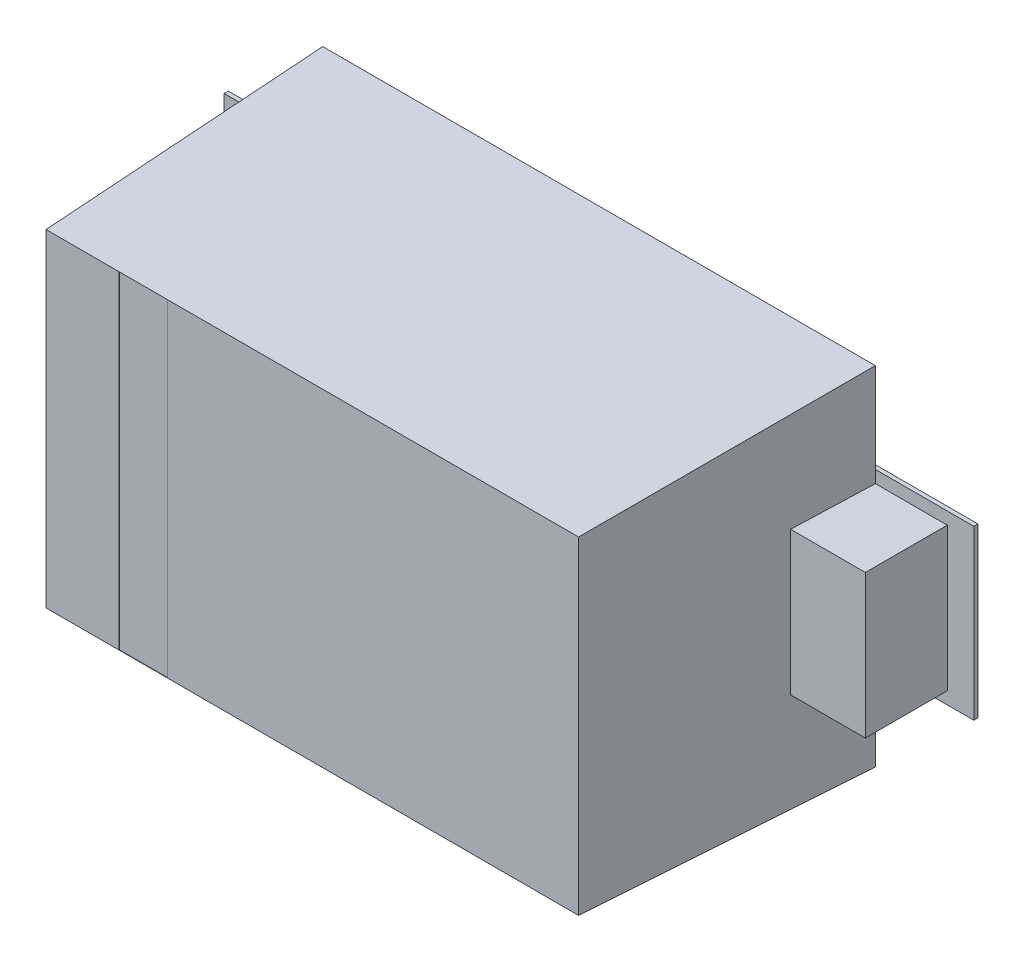
ISO-10303-21;
HEADER;
FILE_DESCRIPTION(('STEP AP214'),'2;1');
FILE_NAME('part.step','',(''),(''),'','','');
FILE_SCHEMA(('AUTOMOTIVE_DESIGN { 1 0 10303 214 1 1 1 1 }'));
ENDSEC;
DATA;
#1=APPLICATION_CONTEXT('core data for automotive mechanical design processes');
#2=APPLICATION_PROTOCOL_DEFINITION('international standard','automotive_design',2000,#1);
#3=PRODUCT_CONTEXT('',#1,'mechanical');
#4=PRODUCT('Part','Part','',(#3));
#5=PRODUCT_RELATED_PRODUCT_CATEGORY('part','',(#4));
#6=PRODUCT_DEFINITION_FORMATION('','',#4);
#7=PRODUCT_DEFINITION_CONTEXT('part definition',#1,'design');
#8=PRODUCT_DEFINITION('design','',#6,#7);
#9=PRODUCT_DEFINITION_SHAPE('','',#8);
#10=(LENGTH_UNIT() NAMED_UNIT(*) SI_UNIT(.MILLI.,.METRE.));
#11=(NAMED_UNIT(*) PLANE_ANGLE_UNIT() SI_UNIT($,.RADIAN.));
#12=(NAMED_UNIT(*) SI_UNIT($,.STERADIAN.) SOLID_ANGLE_UNIT());
#13=UNCERTAINTY_MEASURE_WITH_UNIT(LENGTH_MEASURE(1.E-05),#10,'distance_accuracy_value','');
#14=(GEOMETRIC_REPRESENTATION_CONTEXT(3) GLOBAL_UNCERTAINTY_ASSIGNED_CONTEXT((#13)) GLOBAL_UNIT_ASSIGNED_CONTEXT((#10,
#11,#12)) REPRESENTATION_CONTEXT('',''));
#15=CARTESIAN_POINT('',(0.,0.,0.));
#16=DIRECTION('',(0.,0.,1.));
#17=DIRECTION('',(1.,0.,0.));
#18=AXIS2_PLACEMENT_3D('',#15,#16,#17);
#19=CARTESIAN_POINT('',(-0.85,-1.55082251453114,0.21));
#20=DIRECTION('',(1.,0.,0.));
#21=DIRECTION('',(0.,0.,-1.));
#22=AXIS2_PLACEMENT_3D('',#19,#20,#21);
#23=PLANE('',#22);
#24=DIRECTION('',(0.,1.,0.));
#25=VECTOR('',#24,1.);
#26=CARTESIAN_POINT('',(-0.85,-1.55082251453114,0.21));
#27=LINE('',#26,#25);
#28=CARTESIAN_POINT('',(-0.85,0.175,0.21));
#29=VERTEX_POINT('',#28);
#30=CARTESIAN_POINT('',(-0.85,-0.175,0.21));
#31=VERTEX_POINT('',#30);
#32=EDGE_CURVE('E261',#29,#31,#27,.F.);
#33=ORIENTED_EDGE('',*,*,#32,.F.);
#34=DIRECTION('',(0.,0.,1.));
#35=VECTOR('',#34,1.);
#36=CARTESIAN_POINT('',(-0.85,0.175,0.21));
#37=LINE('',#36,#35);
#38=CARTESIAN_POINT('',(-0.85,0.175,0.01));
#39=VERTEX_POINT('',#38);
#40=EDGE_CURVE('E253',#39,#29,#37,.T.);
#41=ORIENTED_EDGE('',*,*,#40,.F.);
#42=DIRECTION('',(0.,1.,0.));
#43=VECTOR('',#42,1.);
#44=CARTESIAN_POINT('',(-0.85,-0.205,0.01));
#45=LINE('',#44,#43);
#46=CARTESIAN_POINT('',(-0.85,-0.175,0.01));
#47=VERTEX_POINT('',#46);
#48=EDGE_CURVE('E274',#47,#39,#45,.T.);
#49=ORIENTED_EDGE('',*,*,#48,.F.);
#50=DIRECTION('',(0.,0.,1.));
#51=VECTOR('',#50,1.);
#52=CARTESIAN_POINT('',(-0.85,-0.175,0.21));
#53=LINE('',#52,#51);
#54=EDGE_CURVE('E263',#47,#31,#53,.T.);
#55=ORIENTED_EDGE('',*,*,#54,.T.);
#56=EDGE_LOOP('',(#33,#41,#49,#55));
#57=FACE_BOUND('',#56,.T.);
#58=ADVANCED_FACE('F16',(#57),#23,.F.);
#59=CARTESIAN_POINT('',(-0.471442359222918,0.4,0.709));
#60=DIRECTION('',(-1.,0.,0.));
#61=DIRECTION('',(0.,0.,1.));
#62=AXIS2_PLACEMENT_3D('',#59,#60,#61);
#63=PLANE('',#62);
#64=DIRECTION('',(0.,1.,0.));
#65=VECTOR('',#64,1.);
#66=CARTESIAN_POINT('',(-0.471442359222918,-0.4,0.709));
#67=LINE('',#66,#65);
#68=CARTESIAN_POINT('',(-0.471442359222918,0.4,0.709));
#69=VERTEX_POINT('',#68);
#70=CARTESIAN_POINT('',(-0.471442359222918,-0.4,0.709));
#71=VERTEX_POINT('',#70);
#72=EDGE_CURVE('E240',#69,#71,#67,.F.);
#73=ORIENTED_EDGE('',*,*,#72,.F.);
#74=DIRECTION('',(0.,0.,1.));
#75=VECTOR('',#74,1.);
#76=CARTESIAN_POINT('',(-0.471442359222918,0.4,0.709));
#77=LINE('',#76,#75);
#78=CARTESIAN_POINT('',(-0.471442359222918,0.4,0.71));
#79=VERTEX_POINT('',#78);
#80=EDGE_CURVE('E248',#69,#79,#77,.T.);
#81=ORIENTED_EDGE('',*,*,#80,.T.);
#82=DIRECTION('',(0.,1.,0.));
#83=VECTOR('',#82,1.);
#84=CARTESIAN_POINT('',(-0.471442359222918,-0.4,0.71));
#85=LINE('',#84,#83);
#86=CARTESIAN_POINT('',(-0.471442359222918,-0.4,0.71));
#87=VERTEX_POINT('',#86);
#88=EDGE_CURVE('E247',#87,#79,#85,.T.);
#89=ORIENTED_EDGE('',*,*,#88,.F.);
#90=DIRECTION('',(0.,0.,1.));
#91=VECTOR('',#90,1.);
#92=CARTESIAN_POINT('',(-0.471442359222918,-0.4,0.709));
#93=LINE('',#92,#91);
#94=EDGE_CURVE('E245',#87,#71,#93,.F.);
#95=ORIENTED_EDGE('',*,*,#94,.T.);
#96=EDGE_LOOP('',(#73,#81,#89,#95));
#97=FACE_BOUND('',#96,.T.);
#98=ADVANCED_FACE('F813',(#97),#63,.F.);
#99=CARTESIAN_POINT('',(-0.471442359222918,-0.4,0.709));
#100=DIRECTION('',(0.,0.,1.));
#101=DIRECTION('',(1.,0.,0.));
#102=AXIS2_PLACEMENT_3D('',#99,#100,#101);
#103=PLANE('',#102);
#104=ORIENTED_EDGE('',*,*,#72,.T.);
#105=DIRECTION('',(1.,0.,0.));
#106=VECTOR('',#105,1.);
#107=CARTESIAN_POINT('',(-0.471442359222918,-0.4,0.709));
#108=LINE('',#107,#106);
#109=CARTESIAN_POINT('',(-0.353826801828427,-0.4,0.709));
#110=VERTEX_POINT('',#109);
#111=EDGE_CURVE('E244',#71,#110,#108,.T.);
#112=ORIENTED_EDGE('',*,*,#111,.T.);
#113=DIRECTION('',(0.,1.,0.));
#114=VECTOR('',#113,1.);
#115=CARTESIAN_POINT('',(-0.353826801828427,0.4,0.709));
#116=LINE('',#115,#114);
#117=CARTESIAN_POINT('',(-0.353826801828427,0.4,0.709));
#118=VERTEX_POINT('',#117);
#119=EDGE_CURVE('E195',#110,#118,#116,.T.);
#120=ORIENTED_EDGE('',*,*,#119,.T.);
#121=DIRECTION('',(1.,0.,0.));
#122=VECTOR('',#121,1.);
#123=CARTESIAN_POINT('',(-0.471442359222918,0.4,0.709));
#124=LINE('',#123,#122);
#125=EDGE_CURVE('E193',#118,#69,#124,.F.);
#126=ORIENTED_EDGE('',*,*,#125,.T.);
#127=EDGE_LOOP('',(#104,#112,#120,#126));
#128=FACE_BOUND('',#127,.T.);
#129=ADVANCED_FACE('F804',(#128),#103,.T.);
#130=CARTESIAN_POINT('',(-0.353826801828427,0.4,0.709));
#131=DIRECTION('',(1.,0.,0.));
#132=DIRECTION('',(0.,0.,-1.));
#133=AXIS2_PLACEMENT_3D('',#130,#131,#132);
#134=PLANE('',#133);
#135=ORIENTED_EDGE('',*,*,#119,.F.);
#136=DIRECTION('',(0.,0.,-1.));
#137=VECTOR('',#136,1.);
#138=CARTESIAN_POINT('',(-0.353826801828427,-0.4,0.709));
#139=LINE('',#138,#137);
#140=CARTESIAN_POINT('',(-0.353826801828427,-0.4,0.71));
#141=VERTEX_POINT('',#140);
#142=EDGE_CURVE('E200',#110,#141,#139,.F.);
#143=ORIENTED_EDGE('',*,*,#142,.T.);
#144=DIRECTION('',(0.,1.,0.));
#145=VECTOR('',#144,1.);
#146=CARTESIAN_POINT('',(-0.353826801828427,-0.4,0.71));
#147=LINE('',#146,#145);
#148=CARTESIAN_POINT('',(-0.353826801828427,0.4,0.71));
#149=VERTEX_POINT('',#148);
#150=EDGE_CURVE('E197',#149,#141,#147,.F.);
#151=ORIENTED_EDGE('',*,*,#150,.F.);
#152=DIRECTION('',(0.,0.,-1.));
#153=VECTOR('',#152,1.);
#154=CARTESIAN_POINT('',(-0.353826801828427,0.4,0.709));
#155=LINE('',#154,#153);
#156=EDGE_CURVE('E19',#149,#118,#155,.T.);
#157=ORIENTED_EDGE('',*,*,#156,.T.);
#158=EDGE_LOOP('',(#135,#143,#151,#157));
#159=FACE_BOUND('',#158,.T.);
#160=ADVANCED_FACE('F198',(#159),#134,.F.);
#161=CARTESIAN_POINT('',(0.85,-1.55082251453114,0.21));
#162=DIRECTION('',(1.,0.,0.));
#163=DIRECTION('',(0.,0.,-1.));
#164=AXIS2_PLACEMENT_3D('',#161,#162,#163);
#165=PLANE('',#164);
#166=DIRECTION('',(0.,1.,0.));
#167=VECTOR('',#166,1.);
#168=CARTESIAN_POINT('',(0.85,-0.205,0.01));
#169=LINE('',#168,#167);
#170=CARTESIAN_POINT('',(0.85,-0.175,0.01));
#171=VERTEX_POINT('',#170);
#172=CARTESIAN_POINT('',(0.85,0.175,0.01));
#173=VERTEX_POINT('',#172);
#174=EDGE_CURVE('E329',#171,#173,#169,.T.);
#175=ORIENTED_EDGE('',*,*,#174,.T.);
#176=DIRECTION('',(0.,0.,-1.));
#177=VECTOR('',#176,1.);
#178=CARTESIAN_POINT('',(0.85,0.175,0.21));
#179=LINE('',#178,#177);
#180=CARTESIAN_POINT('',(0.85,0.175,0.21));
#181=VERTEX_POINT('',#180);
#182=EDGE_CURVE('E322',#173,#181,#179,.F.);
#183=ORIENTED_EDGE('',*,*,#182,.T.);
#184=DIRECTION('',(0.,1.,0.));
#185=VECTOR('',#184,1.);
#186=CARTESIAN_POINT('',(0.85,-1.55082251453114,0.21));
#187=LINE('',#186,#185);
#188=CARTESIAN_POINT('',(0.85,-0.175,0.21));
#189=VERTEX_POINT('',#188);
#190=EDGE_CURVE('E317',#189,#181,#187,.T.);
#191=ORIENTED_EDGE('',*,*,#190,.F.);
#192=DIRECTION('',(0.,0.,-1.));
#193=VECTOR('',#192,1.);
#194=CARTESIAN_POINT('',(0.85,-0.175,0.21));
#195=LINE('',#194,#193);
#196=EDGE_CURVE('E243',#171,#189,#195,.F.);
#197=ORIENTED_EDGE('',*,*,#196,.F.);
#198=EDGE_LOOP('',(#175,#183,#191,#197));
#199=FACE_BOUND('',#198,.T.);
#200=ADVANCED_FACE('F498',(#199),#165,.T.);
#201=CARTESIAN_POINT('',(-0.471442359222918,0.4,0.709));
#202=DIRECTION('',(0.,1.,0.));
#203=DIRECTION('',(0.,0.,1.));
#204=AXIS2_PLACEMENT_3D('',#201,#202,#203);
#205=PLANE('',#204);
#206=ORIENTED_EDGE('',*,*,#125,.F.);
#207=ORIENTED_EDGE('',*,*,#156,.F.);
#208=DIRECTION('',(1.,0.,0.));
#209=VECTOR('',#208,1.);
#210=CARTESIAN_POINT('',(-0.65,0.4,0.71));
#211=LINE('',#210,#209);
#212=EDGE_CURVE('E191',#79,#149,#211,.T.);
#213=ORIENTED_EDGE('',*,*,#212,.F.);
#214=ORIENTED_EDGE('',*,*,#80,.F.);
#215=EDGE_LOOP('',(#206,#207,#213,#214));
#216=FACE_BOUND('',#215,.T.);
#217=ADVANCED_FACE('F188',(#216),#205,.F.);
#218=CARTESIAN_POINT('',(-0.914999999999999,-0.205,0.));
#219=DIRECTION('',(0.,0.,1.));
#220=DIRECTION('',(1.,0.,0.));
#221=AXIS2_PLACEMENT_3D('',#218,#219,#220);
#222=PLANE('',#221);
#223=DIRECTION('',(0.,1.,0.));
#224=VECTOR('',#223,1.);
#225=CARTESIAN_POINT('',(-0.504999999999999,0.205,0.));
#226=LINE('',#225,#224);
#227=CARTESIAN_POINT('',(-0.504999999999999,0.205,0.));
#228=VERTEX_POINT('',#227);
#229=CARTESIAN_POINT('',(-0.504999999999999,-0.205,0.));
#230=VERTEX_POINT('',#229);
#231=EDGE_CURVE('E361',#228,#230,#226,.F.);
#232=ORIENTED_EDGE('',*,*,#231,.T.);
#233=DIRECTION('',(1.,0.,0.));
#234=VECTOR('',#233,1.);
#235=CARTESIAN_POINT('',(-0.914999999999999,-0.205,0.));
#236=LINE('',#235,#234);
#237=CARTESIAN_POINT('',(-0.914999999999999,-0.205,0.));
#238=VERTEX_POINT('',#237);
#239=EDGE_CURVE('E364',#230,#238,#236,.F.);
#240=ORIENTED_EDGE('',*,*,#239,.T.);
#241=DIRECTION('',(0.,1.,0.));
#242=VECTOR('',#241,1.);
#243=CARTESIAN_POINT('',(-0.914999999999999,0.205,0.));
#244=LINE('',#243,#242);
#245=CARTESIAN_POINT('',(-0.914999999999999,0.205,0.));
#246=VERTEX_POINT('',#245);
#247=EDGE_CURVE('E249',#238,#246,#244,.T.);
#248=ORIENTED_EDGE('',*,*,#247,.T.);
#249=DIRECTION('',(1.,0.,0.));
#250=VECTOR('',#249,1.);
#251=CARTESIAN_POINT('',(-0.914999999999999,0.205,0.));
#252=LINE('',#251,#250);
#253=EDGE_CURVE('E218',#246,#228,#252,.T.);
#254=ORIENTED_EDGE('',*,*,#253,.T.);
#255=EDGE_LOOP('',(#232,#240,#248,#254));
#256=FACE_BOUND('',#255,.T.);
#257=ADVANCED_FACE('F489',(#256),#222,.F.);
#258=CARTESIAN_POINT('',(-0.914999999999999,0.205,0.01));
#259=DIRECTION('',(1.,0.,0.));
#260=DIRECTION('',(0.,0.,-1.));
#261=AXIS2_PLACEMENT_3D('',#258,#259,#260);
#262=PLANE('',#261);
#263=DIRECTION('',(0.,1.,0.));
#264=VECTOR('',#263,1.);
#265=CARTESIAN_POINT('',(-0.914999999999999,-0.205,0.01));
#266=LINE('',#265,#264);
#267=CARTESIAN_POINT('',(-0.914999999999999,0.205,0.01));
#268=VERTEX_POINT('',#267);
#269=CARTESIAN_POINT('',(-0.914999999999999,-0.205,0.01));
#270=VERTEX_POINT('',#269);
#271=EDGE_CURVE('E269',#268,#270,#266,.F.);
#272=ORIENTED_EDGE('',*,*,#271,.F.);
#273=DIRECTION('',(0.,0.,-1.));
#274=VECTOR('',#273,1.);
#275=CARTESIAN_POINT('',(-0.914999999999999,0.205,0.01));
#276=LINE('',#275,#274);
#277=EDGE_CURVE('E355',#268,#246,#276,.T.);
#278=ORIENTED_EDGE('',*,*,#277,.T.);
#279=ORIENTED_EDGE('',*,*,#247,.F.);
#280=DIRECTION('',(0.,0.,1.));
#281=VECTOR('',#280,1.);
#282=CARTESIAN_POINT('',(-0.914999999999999,-0.205,0.01));
#283=LINE('',#282,#281);
#284=EDGE_CURVE('E367',#238,#270,#283,.T.);
#285=ORIENTED_EDGE('',*,*,#284,.T.);
#286=EDGE_LOOP('',(#272,#278,#279,#285));
#287=FACE_BOUND('',#286,.T.);
#288=ADVANCED_FACE('F487',(#287),#262,.F.);
#289=CARTESIAN_POINT('',(-0.0324999999999995,0.175,0.21));
#290=DIRECTION('',(0.,1.,0.));
#291=DIRECTION('',(0.,0.,1.));
#292=AXIS2_PLACEMENT_3D('',#289,#290,#291);
#293=PLANE('',#292);
#294=DIRECTION('',(1.,0.,0.));
#295=VECTOR('',#294,1.);
#296=CARTESIAN_POINT('',(-0.0324999999999995,0.175,0.21));
#297=LINE('',#296,#295);
#298=CARTESIAN_POINT('',(-0.667460384745874,0.175,0.21));
#299=VERTEX_POINT('',#298);
#300=EDGE_CURVE('E258',#299,#29,#297,.F.);
#301=ORIENTED_EDGE('',*,*,#300,.F.);
#302=DIRECTION('',(0.034899496702501,0.,0.999390827019096));
#303=VECTOR('',#302,1.);
#304=CARTESIAN_POINT('',(-0.65,0.175,0.71));
#305=LINE('',#304,#303);
#306=CARTESIAN_POINT('',(-0.674444538644223,0.175,0.01));
#307=VERTEX_POINT('',#306);
#308=EDGE_CURVE('E379',#307,#299,#305,.T.);
#309=ORIENTED_EDGE('',*,*,#308,.F.);
#310=DIRECTION('',(1.,0.,0.));
#311=VECTOR('',#310,1.);
#312=CARTESIAN_POINT('',(-0.914999999999999,0.175,0.01));
#313=LINE('',#312,#311);
#314=EDGE_CURVE('E276',#39,#307,#313,.T.);
#315=ORIENTED_EDGE('',*,*,#314,.F.);
#316=ORIENTED_EDGE('',*,*,#40,.T.);
#317=EDGE_LOOP('',(#301,#309,#315,#316));
#318=FACE_BOUND('',#317,.T.);
#319=ADVANCED_FACE('F474',(#318),#293,.T.);
#320=CARTESIAN_POINT('',(-0.0324999999999995,-1.55082251453114,0.21));
#321=DIRECTION('',(0.,0.,1.));
#322=DIRECTION('',(1.,0.,0.));
#323=AXIS2_PLACEMENT_3D('',#320,#321,#322);
#324=PLANE('',#323);
#325=DIRECTION('',(1.,0.,0.));
#326=VECTOR('',#325,1.);
#327=CARTESIAN_POINT('',(-0.0324999999999995,-0.175,0.21));
#328=LINE('',#327,#326);
#329=CARTESIAN_POINT('',(-0.667460384745874,-0.175,0.21));
#330=VERTEX_POINT('',#329);
#331=EDGE_CURVE('E266',#31,#330,#328,.T.);
#332=ORIENTED_EDGE('',*,*,#331,.T.);
#333=DIRECTION('',(0.,1.,0.));
#334=VECTOR('',#333,1.);
#335=CARTESIAN_POINT('',(-0.667460384745874,0.4,0.21));
#336=LINE('',#335,#334);
#337=EDGE_CURVE('E381',#299,#330,#336,.F.);
#338=ORIENTED_EDGE('',*,*,#337,.F.);
#339=ORIENTED_EDGE('',*,*,#300,.T.);
#340=ORIENTED_EDGE('',*,*,#32,.T.);
#341=EDGE_LOOP('',(#332,#338,#339,#340));
#342=FACE_BOUND('',#341,.T.);
#343=ADVANCED_FACE('F479',(#342),#324,.T.);
#344=CARTESIAN_POINT('',(-0.0324999999999995,-0.175,0.21));
#345=DIRECTION('',(0.,1.,0.));
#346=DIRECTION('',(0.,0.,1.));
#347=AXIS2_PLACEMENT_3D('',#344,#345,#346);
#348=PLANE('',#347);
#349=ORIENTED_EDGE('',*,*,#54,.F.);
#350=DIRECTION('',(1.,0.,0.));
#351=VECTOR('',#350,1.);
#352=CARTESIAN_POINT('',(-0.914999999999999,-0.175,0.01));
#353=LINE('',#352,#351);
#354=CARTESIAN_POINT('',(-0.674444538644223,-0.175,0.01));
#355=VERTEX_POINT('',#354);
#356=EDGE_CURVE('E271',#355,#47,#353,.F.);
#357=ORIENTED_EDGE('',*,*,#356,.F.);
#358=DIRECTION('',(0.034899496702501,0.,0.999390827019096));
#359=VECTOR('',#358,1.);
#360=CARTESIAN_POINT('',(-0.65,-0.175,0.71));
#361=LINE('',#360,#359);
#362=EDGE_CURVE('E383',#330,#355,#361,.F.);
#363=ORIENTED_EDGE('',*,*,#362,.F.);
#364=ORIENTED_EDGE('',*,*,#331,.F.);
#365=EDGE_LOOP('',(#349,#357,#363,#364));
#366=FACE_BOUND('',#365,.T.);
#367=ADVANCED_FACE('F484',(#366),#348,.F.);
#368=CARTESIAN_POINT('',(-0.914999999999999,-0.205,0.01));
#369=DIRECTION('',(0.,0.,1.));
#370=DIRECTION('',(1.,0.,0.));
#371=AXIS2_PLACEMENT_3D('',#368,#369,#370);
#372=PLANE('',#371);
#373=ORIENTED_EDGE('',*,*,#314,.T.);
#374=DIRECTION('',(0.,1.,0.));
#375=VECTOR('',#374,1.);
#376=CARTESIAN_POINT('',(-0.674444538644223,0.4,0.01));
#377=LINE('',#376,#375);
#378=CARTESIAN_POINT('',(-0.674444538644223,0.205,0.01));
#379=VERTEX_POINT('',#378);
#380=EDGE_CURVE('E376',#379,#307,#377,.F.);
#381=ORIENTED_EDGE('',*,*,#380,.F.);
#382=DIRECTION('',(1.,0.,0.));
#383=VECTOR('',#382,1.);
#384=CARTESIAN_POINT('',(-0.914999999999999,0.205,0.01));
#385=LINE('',#384,#383);
#386=EDGE_CURVE('E352',#379,#268,#385,.F.);
#387=ORIENTED_EDGE('',*,*,#386,.T.);
#388=ORIENTED_EDGE('',*,*,#271,.T.);
#389=DIRECTION('',(1.,0.,0.));
#390=VECTOR('',#389,1.);
#391=CARTESIAN_POINT('',(-0.914999999999999,-0.205,0.01));
#392=LINE('',#391,#390);
#393=CARTESIAN_POINT('',(-0.674444538644223,-0.205,0.01));
#394=VERTEX_POINT('',#393);
#395=EDGE_CURVE('E370',#270,#394,#392,.T.);
#396=ORIENTED_EDGE('',*,*,#395,.T.);
#397=DIRECTION('',(0.,1.,0.));
#398=VECTOR('',#397,1.);
#399=CARTESIAN_POINT('',(-0.674444538644223,0.4,0.01));
#400=LINE('',#399,#398);
#401=EDGE_CURVE('E294',#355,#394,#400,.F.);
#402=ORIENTED_EDGE('',*,*,#401,.F.);
#403=ORIENTED_EDGE('',*,*,#356,.T.);
#404=ORIENTED_EDGE('',*,*,#48,.T.);
#405=EDGE_LOOP('',(#373,#381,#387,#388,#396,#402,#403,#404));
#406=FACE_BOUND('',#405,.T.);
#407=ADVANCED_FACE('F469',(#406),#372,.T.);
#408=CARTESIAN_POINT('',(-0.65,-0.4,0.71));
#409=DIRECTION('',(0.,0.,1.));
#410=DIRECTION('',(1.,0.,0.));
#411=AXIS2_PLACEMENT_3D('',#408,#409,#410);
#412=PLANE('',#411);
#413=ORIENTED_EDGE('',*,*,#88,.T.);
#414=DIRECTION('',(1.,0.,0.));
#415=VECTOR('',#414,1.);
#416=CARTESIAN_POINT('',(-0.65,0.4,0.71));
#417=LINE('',#416,#415);
#418=CARTESIAN_POINT('',(-0.65,0.4,0.71));
#419=VERTEX_POINT('',#418);
#420=EDGE_CURVE('E216',#419,#79,#417,.T.);
#421=ORIENTED_EDGE('',*,*,#420,.F.);
#422=DIRECTION('',(0.,1.,0.));
#423=VECTOR('',#422,1.);
#424=CARTESIAN_POINT('',(-0.65,0.4,0.71));
#425=LINE('',#424,#423);
#426=CARTESIAN_POINT('',(-0.65,-0.4,0.71));
#427=VERTEX_POINT('',#426);
#428=EDGE_CURVE('E283',#427,#419,#425,.T.);
#429=ORIENTED_EDGE('',*,*,#428,.F.);
#430=DIRECTION('',(1.,0.,0.));
#431=VECTOR('',#430,1.);
#432=CARTESIAN_POINT('',(-0.65,-0.4,0.71));
#433=LINE('',#432,#431);
#434=EDGE_CURVE('E282',#87,#427,#433,.F.);
#435=ORIENTED_EDGE('',*,*,#434,.F.);
#436=EDGE_LOOP('',(#413,#421,#429,#435));
#437=FACE_BOUND('',#436,.T.);
#438=ADVANCED_FACE('F559',(#437),#412,.T.);
#439=CARTESIAN_POINT('',(-0.471442359222918,-0.4,0.709));
#440=DIRECTION('',(0.,-1.,0.));
#441=DIRECTION('',(0.,0.,-1.));
#442=AXIS2_PLACEMENT_3D('',#439,#440,#441);
#443=PLANE('',#442);
#444=ORIENTED_EDGE('',*,*,#111,.F.);
#445=ORIENTED_EDGE('',*,*,#94,.F.);
#446=DIRECTION('',(1.,0.,0.));
#447=VECTOR('',#446,1.);
#448=CARTESIAN_POINT('',(-0.65,-0.4,0.71));
#449=LINE('',#448,#447);
#450=EDGE_CURVE('E307',#141,#87,#449,.F.);
#451=ORIENTED_EDGE('',*,*,#450,.F.);
#452=ORIENTED_EDGE('',*,*,#142,.F.);
#453=EDGE_LOOP('',(#444,#445,#451,#452));
#454=FACE_BOUND('',#453,.T.);
#455=ADVANCED_FACE('F555',(#454),#443,.F.);
#456=CARTESIAN_POINT('',(-0.0324999999999995,-0.175,0.21));
#457=DIRECTION('',(0.,-1.,0.));
#458=DIRECTION('',(0.,0.,-1.));
#459=AXIS2_PLACEMENT_3D('',#456,#457,#458);
#460=PLANE('',#459);
#461=DIRECTION('',(0.034899496702501,0.,-0.999390827019096));
#462=VECTOR('',#461,1.);
#463=CARTESIAN_POINT('',(0.65,-0.175,0.71));
#464=LINE('',#463,#462);
#465=CARTESIAN_POINT('',(0.674444538644223,-0.175,0.01));
#466=VERTEX_POINT('',#465);
#467=CARTESIAN_POINT('',(0.667460384745874,-0.175,0.21));
#468=VERTEX_POINT('',#467);
#469=EDGE_CURVE('E310',#466,#468,#464,.F.);
#470=ORIENTED_EDGE('',*,*,#469,.F.);
#471=DIRECTION('',(-1.,0.,0.));
#472=VECTOR('',#471,1.);
#473=CARTESIAN_POINT('',(0.914999999999999,-0.175,0.01));
#474=LINE('',#473,#472);
#475=EDGE_CURVE('E206',#466,#171,#474,.F.);
#476=ORIENTED_EDGE('',*,*,#475,.T.);
#477=ORIENTED_EDGE('',*,*,#196,.T.);
#478=DIRECTION('',(1.,0.,0.));
#479=VECTOR('',#478,1.);
#480=CARTESIAN_POINT('',(-0.0324999999999995,-0.175,0.21));
#481=LINE('',#480,#479);
#482=EDGE_CURVE('E319',#468,#189,#481,.T.);
#483=ORIENTED_EDGE('',*,*,#482,.F.);
#484=EDGE_LOOP('',(#470,#476,#477,#483));
#485=FACE_BOUND('',#484,.T.);
#486=ADVANCED_FACE('F551',(#485),#460,.T.);
#487=CARTESIAN_POINT('',(-0.0324999999999995,-1.55082251453114,0.21));
#488=DIRECTION('',(0.,0.,1.));
#489=DIRECTION('',(1.,0.,0.));
#490=AXIS2_PLACEMENT_3D('',#487,#488,#489);
#491=PLANE('',#490);
#492=DIRECTION('',(0.,1.,0.));
#493=VECTOR('',#492,1.);
#494=CARTESIAN_POINT('',(0.667460384745874,0.4,0.21));
#495=LINE('',#494,#493);
#496=CARTESIAN_POINT('',(0.667460384745874,0.175,0.21));
#497=VERTEX_POINT('',#496);
#498=EDGE_CURVE('E387',#468,#497,#495,.T.);
#499=ORIENTED_EDGE('',*,*,#498,.F.);
#500=ORIENTED_EDGE('',*,*,#482,.T.);
#501=ORIENTED_EDGE('',*,*,#190,.T.);
#502=DIRECTION('',(1.,0.,0.));
#503=VECTOR('',#502,1.);
#504=CARTESIAN_POINT('',(-0.0324999999999995,0.175,0.21));
#505=LINE('',#504,#503);
#506=EDGE_CURVE('E207',#181,#497,#505,.F.);
#507=ORIENTED_EDGE('',*,*,#506,.T.);
#508=EDGE_LOOP('',(#499,#500,#501,#507));
#509=FACE_BOUND('',#508,.T.);
#510=ADVANCED_FACE('F547',(#509),#491,.T.);
#511=CARTESIAN_POINT('',(-0.0324999999999995,0.175,0.21));
#512=DIRECTION('',(0.,-1.,0.));
#513=DIRECTION('',(0.,0.,-1.));
#514=AXIS2_PLACEMENT_3D('',#511,#512,#513);
#515=PLANE('',#514);
#516=ORIENTED_EDGE('',*,*,#506,.F.);
#517=ORIENTED_EDGE('',*,*,#182,.F.);
#518=DIRECTION('',(-1.,0.,0.));
#519=VECTOR('',#518,1.);
#520=CARTESIAN_POINT('',(0.914999999999999,0.175,0.01));
#521=LINE('',#520,#519);
#522=CARTESIAN_POINT('',(0.674444538644223,0.175,0.01));
#523=VERTEX_POINT('',#522);
#524=EDGE_CURVE('E332',#173,#523,#521,.T.);
#525=ORIENTED_EDGE('',*,*,#524,.T.);
#526=DIRECTION('',(0.034899496702501,0.,-0.999390827019096));
#527=VECTOR('',#526,1.);
#528=CARTESIAN_POINT('',(0.65,0.175,0.71));
#529=LINE('',#528,#527);
#530=EDGE_CURVE('E389',#497,#523,#529,.T.);
#531=ORIENTED_EDGE('',*,*,#530,.F.);
#532=EDGE_LOOP('',(#516,#517,#525,#531));
#533=FACE_BOUND('',#532,.T.);
#534=ADVANCED_FACE('F544',(#533),#515,.F.);
#535=CARTESIAN_POINT('',(-0.65,-0.4,0.71));
#536=DIRECTION('',(0.,0.,1.));
#537=DIRECTION('',(1.,0.,0.));
#538=AXIS2_PLACEMENT_3D('',#535,#536,#537);
#539=PLANE('',#538);
#540=ORIENTED_EDGE('',*,*,#150,.T.);
#541=DIRECTION('',(1.,0.,0.));
#542=VECTOR('',#541,1.);
#543=CARTESIAN_POINT('',(-0.65,-0.4,0.71));
#544=LINE('',#543,#542);
#545=CARTESIAN_POINT('',(0.65,-0.4,0.71));
#546=VERTEX_POINT('',#545);
#547=EDGE_CURVE('E290',#546,#141,#544,.F.);
#548=ORIENTED_EDGE('',*,*,#547,.F.);
#549=DIRECTION('',(0.,1.,0.));
#550=VECTOR('',#549,1.);
#551=CARTESIAN_POINT('',(0.65,0.4,0.71));
#552=LINE('',#551,#550);
#553=CARTESIAN_POINT('',(0.65,0.4,0.71));
#554=VERTEX_POINT('',#553);
#555=EDGE_CURVE('E222',#554,#546,#552,.F.);
#556=ORIENTED_EDGE('',*,*,#555,.F.);
#557=DIRECTION('',(1.,0.,0.));
#558=VECTOR('',#557,1.);
#559=CARTESIAN_POINT('',(-0.65,0.4,0.71));
#560=LINE('',#559,#558);
#561=EDGE_CURVE('E212',#149,#554,#560,.T.);
#562=ORIENTED_EDGE('',*,*,#561,.F.);
#563=EDGE_LOOP('',(#540,#548,#556,#562));
#564=FACE_BOUND('',#563,.T.);
#565=ADVANCED_FACE('F221',(#564),#539,.T.);
#566=CARTESIAN_POINT('',(0.914999999999999,-0.205,0.));
#567=DIRECTION('',(0.,0.,-1.));
#568=DIRECTION('',(-1.,0.,0.));
#569=AXIS2_PLACEMENT_3D('',#566,#567,#568);
#570=PLANE('',#569);
#571=DIRECTION('',(0.,1.,0.));
#572=VECTOR('',#571,1.);
#573=CARTESIAN_POINT('',(0.914999999999999,0.205,0.));
#574=LINE('',#573,#572);
#575=CARTESIAN_POINT('',(0.914999999999999,0.205,0.));
#576=VERTEX_POINT('',#575);
#577=CARTESIAN_POINT('',(0.914999999999999,-0.205,0.));
#578=VERTEX_POINT('',#577);
#579=EDGE_CURVE('E335',#576,#578,#574,.F.);
#580=ORIENTED_EDGE('',*,*,#579,.T.);
#581=DIRECTION('',(1.,0.,0.));
#582=VECTOR('',#581,1.);
#583=CARTESIAN_POINT('',(0.914999999999999,-0.205,0.));
#584=LINE('',#583,#582);
#585=CARTESIAN_POINT('',(0.504999999999999,-0.205,0.));
#586=VERTEX_POINT('',#585);
#587=EDGE_CURVE('E394',#578,#586,#584,.F.);
#588=ORIENTED_EDGE('',*,*,#587,.T.);
#589=DIRECTION('',(0.,1.,0.));
#590=VECTOR('',#589,1.);
#591=CARTESIAN_POINT('',(0.504999999999999,0.205,0.));
#592=LINE('',#591,#590);
#593=CARTESIAN_POINT('',(0.504999999999999,0.205,0.));
#594=VERTEX_POINT('',#593);
#595=EDGE_CURVE('E340',#586,#594,#592,.T.);
#596=ORIENTED_EDGE('',*,*,#595,.T.);
#597=DIRECTION('',(1.,0.,0.));
#598=VECTOR('',#597,1.);
#599=CARTESIAN_POINT('',(0.914999999999999,0.205,0.));
#600=LINE('',#599,#598);
#601=EDGE_CURVE('E343',#594,#576,#600,.T.);
#602=ORIENTED_EDGE('',*,*,#601,.T.);
#603=EDGE_LOOP('',(#580,#588,#596,#602));
#604=FACE_BOUND('',#603,.T.);
#605=ADVANCED_FACE('F537',(#604),#570,.T.);
#606=CARTESIAN_POINT('',(0.914999999999999,-0.205,0.01));
#607=DIRECTION('',(0.,0.,-1.));
#608=DIRECTION('',(-1.,0.,0.));
#609=AXIS2_PLACEMENT_3D('',#606,#607,#608);
#610=PLANE('',#609);
#611=ORIENTED_EDGE('',*,*,#524,.F.);
#612=ORIENTED_EDGE('',*,*,#174,.F.);
#613=ORIENTED_EDGE('',*,*,#475,.F.);
#614=DIRECTION('',(0.,1.,0.));
#615=VECTOR('',#614,1.);
#616=CARTESIAN_POINT('',(0.674444538644223,0.4,0.01));
#617=LINE('',#616,#615);
#618=CARTESIAN_POINT('',(0.674444538644224,-0.205,0.01));
#619=VERTEX_POINT('',#618);
#620=EDGE_CURVE('E300',#619,#466,#617,.T.);
#621=ORIENTED_EDGE('',*,*,#620,.F.);
#622=DIRECTION('',(1.,0.,0.));
#623=VECTOR('',#622,1.);
#624=CARTESIAN_POINT('',(0.914999999999999,-0.205,0.01));
#625=LINE('',#624,#623);
#626=CARTESIAN_POINT('',(0.914999999999999,-0.205,0.01));
#627=VERTEX_POINT('',#626);
#628=EDGE_CURVE('E33',#619,#627,#625,.T.);
#629=ORIENTED_EDGE('',*,*,#628,.T.);
#630=DIRECTION('',(0.,1.,0.));
#631=VECTOR('',#630,1.);
#632=CARTESIAN_POINT('',(0.914999999999999,0.205,0.01));
#633=LINE('',#632,#631);
#634=CARTESIAN_POINT('',(0.914999999999999,0.205,0.01));
#635=VERTEX_POINT('',#634);
#636=EDGE_CURVE('E338',#627,#635,#633,.T.);
#637=ORIENTED_EDGE('',*,*,#636,.T.);
#638=DIRECTION('',(1.,0.,0.));
#639=VECTOR('',#638,1.);
#640=CARTESIAN_POINT('',(0.914999999999999,0.205,0.01));
#641=LINE('',#640,#639);
#642=CARTESIAN_POINT('',(0.674444538644223,0.205,0.01));
#643=VERTEX_POINT('',#642);
#644=EDGE_CURVE('E227',#635,#643,#641,.F.);
#645=ORIENTED_EDGE('',*,*,#644,.T.);
#646=DIRECTION('',(0.,1.,0.));
#647=VECTOR('',#646,1.);
#648=CARTESIAN_POINT('',(0.674444538644223,0.4,0.01));
#649=LINE('',#648,#647);
#650=EDGE_CURVE('E235',#523,#643,#649,.T.);
#651=ORIENTED_EDGE('',*,*,#650,.F.);
#652=EDGE_LOOP('',(#611,#612,#613,#621,#629,#637,#645,#651));
#653=FACE_BOUND('',#652,.T.);
#654=ADVANCED_FACE('F533',(#653),#610,.F.);
#655=CARTESIAN_POINT('',(0.914999999999999,0.205,0.01));
#656=DIRECTION('',(-1.,0.,0.));
#657=DIRECTION('',(0.,0.,1.));
#658=AXIS2_PLACEMENT_3D('',#655,#656,#657);
#659=PLANE('',#658);
#660=ORIENTED_EDGE('',*,*,#636,.F.);
#661=DIRECTION('',(0.,0.,1.));
#662=VECTOR('',#661,1.);
#663=CARTESIAN_POINT('',(0.914999999999999,-0.205,0.01));
#664=LINE('',#663,#662);
#665=EDGE_CURVE('E401',#627,#578,#664,.F.);
#666=ORIENTED_EDGE('',*,*,#665,.T.);
#667=ORIENTED_EDGE('',*,*,#579,.F.);
#668=DIRECTION('',(0.,0.,-1.));
#669=VECTOR('',#668,1.);
#670=CARTESIAN_POINT('',(0.914999999999999,0.205,0.01));
#671=LINE('',#670,#669);
#672=EDGE_CURVE('E346',#576,#635,#671,.F.);
#673=ORIENTED_EDGE('',*,*,#672,.T.);
#674=EDGE_LOOP('',(#660,#666,#667,#673));
#675=FACE_BOUND('',#674,.T.);
#676=ADVANCED_FACE('F529',(#675),#659,.F.);
#677=CARTESIAN_POINT('',(0.504999999999999,0.205,0.01));
#678=DIRECTION('',(1.,0.,0.));
#679=DIRECTION('',(0.,0.,-1.));
#680=AXIS2_PLACEMENT_3D('',#677,#678,#679);
#681=PLANE('',#680);
#682=DIRECTION('',(0.,1.,0.));
#683=VECTOR('',#682,1.);
#684=CARTESIAN_POINT('',(0.504999999999999,-0.4,0.01));
#685=LINE('',#684,#683);
#686=CARTESIAN_POINT('',(0.504999999999999,-0.205,0.01));
#687=VERTEX_POINT('',#686);
#688=CARTESIAN_POINT('',(0.504999999999999,0.205,0.01));
#689=VERTEX_POINT('',#688);
#690=EDGE_CURVE('E404',#687,#689,#685,.T.);
#691=ORIENTED_EDGE('',*,*,#690,.T.);
#692=DIRECTION('',(0.,0.,-1.));
#693=VECTOR('',#692,1.);
#694=CARTESIAN_POINT('',(0.504999999999999,0.205,0.01));
#695=LINE('',#694,#693);
#696=EDGE_CURVE('E223',#689,#594,#695,.T.);
#697=ORIENTED_EDGE('',*,*,#696,.T.);
#698=ORIENTED_EDGE('',*,*,#595,.F.);
#699=DIRECTION('',(0.,0.,1.));
#700=VECTOR('',#699,1.);
#701=CARTESIAN_POINT('',(0.504999999999999,-0.205,0.01));
#702=LINE('',#701,#700);
#703=EDGE_CURVE('E397',#586,#687,#702,.T.);
#704=ORIENTED_EDGE('',*,*,#703,.T.);
#705=EDGE_LOOP('',(#691,#697,#698,#704));
#706=FACE_BOUND('',#705,.T.);
#707=ADVANCED_FACE('F525',(#706),#681,.F.);
#708=CARTESIAN_POINT('',(0.914999999999999,0.205,0.01));
#709=DIRECTION('',(0.,-1.,0.));
#710=DIRECTION('',(0.,0.,-1.));
#711=AXIS2_PLACEMENT_3D('',#708,#709,#710);
#712=PLANE('',#711);
#713=DIRECTION('',(1.,0.,0.));
#714=VECTOR('',#713,1.);
#715=CARTESIAN_POINT('',(-0.65,0.205,0.01));
#716=LINE('',#715,#714);
#717=EDGE_CURVE('E407',#689,#643,#716,.T.);
#718=ORIENTED_EDGE('',*,*,#717,.T.);
#719=ORIENTED_EDGE('',*,*,#644,.F.);
#720=ORIENTED_EDGE('',*,*,#672,.F.);
#721=ORIENTED_EDGE('',*,*,#601,.F.);
#722=ORIENTED_EDGE('',*,*,#696,.F.);
#723=EDGE_LOOP('',(#718,#719,#720,#721,#722));
#724=FACE_BOUND('',#723,.T.);
#725=ADVANCED_FACE('F522',(#724),#712,.F.);
#726=CARTESIAN_POINT('',(-0.65,0.4,0.71));
#727=DIRECTION('',(0.,0.999390827019096,0.034899496702501));
#728=DIRECTION('',(0.,-0.034899496702501,0.999390827019096));
#729=AXIS2_PLACEMENT_3D('',#726,#727,#728);
#730=PLANE('',#729);
#731=ORIENTED_EDGE('',*,*,#420,.T.);
#732=ORIENTED_EDGE('',*,*,#212,.T.);
#733=ORIENTED_EDGE('',*,*,#561,.T.);
#734=DIRECTION('',(-0.0348782627423746,-0.034878262742374,0.998782765958718));
#735=VECTOR('',#734,1.);
#736=CARTESIAN_POINT('',(0.674444538644223,0.424444538644223,0.01));
#737=LINE('',#736,#735);
#738=CARTESIAN_POINT('',(0.674444538644223,0.424444538644223,0.01));
#739=VERTEX_POINT('',#738);
#740=EDGE_CURVE('E233',#739,#554,#737,.T.);
#741=ORIENTED_EDGE('',*,*,#740,.F.);
#742=DIRECTION('',(1.,0.,0.));
#743=VECTOR('',#742,1.);
#744=CARTESIAN_POINT('',(-0.65,0.424444538644223,0.01));
#745=LINE('',#744,#743);
#746=CARTESIAN_POINT('',(-0.674444538644224,0.424444538644223,0.01));
#747=VERTEX_POINT('',#746);
#748=EDGE_CURVE('E413',#739,#747,#745,.F.);
#749=ORIENTED_EDGE('',*,*,#748,.T.);
#750=DIRECTION('',(-0.0348782627423746,0.0348782627423755,-0.998782765958718));
#751=VECTOR('',#750,1.);
#752=CARTESIAN_POINT('',(-0.65,0.4,0.71));
#753=LINE('',#752,#751);
#754=EDGE_CURVE('E280',#419,#747,#753,.T.);
#755=ORIENTED_EDGE('',*,*,#754,.F.);
#756=EDGE_LOOP('',(#731,#732,#733,#741,#749,#755));
#757=FACE_BOUND('',#756,.T.);
#758=ADVANCED_FACE('F211',(#757),#730,.T.);
#759=CARTESIAN_POINT('',(-0.914999999999999,0.205,0.01));
#760=DIRECTION('',(0.,-1.,0.));
#761=DIRECTION('',(0.,0.,-1.));
#762=AXIS2_PLACEMENT_3D('',#759,#760,#761);
#763=PLANE('',#762);
#764=ORIENTED_EDGE('',*,*,#386,.F.);
#765=DIRECTION('',(1.,0.,0.));
#766=VECTOR('',#765,1.);
#767=CARTESIAN_POINT('',(-0.65,0.205,0.01));
#768=LINE('',#767,#766);
#769=CARTESIAN_POINT('',(-0.504999999999999,0.205,0.01));
#770=VERTEX_POINT('',#769);
#771=EDGE_CURVE('E419',#379,#770,#768,.T.);
#772=ORIENTED_EDGE('',*,*,#771,.T.);
#773=DIRECTION('',(0.,0.,1.));
#774=VECTOR('',#773,1.);
#775=CARTESIAN_POINT('',(-0.504999999999999,0.205,0.01));
#776=LINE('',#775,#774);
#777=EDGE_CURVE('E358',#770,#228,#776,.F.);
#778=ORIENTED_EDGE('',*,*,#777,.T.);
#779=ORIENTED_EDGE('',*,*,#253,.F.);
#780=ORIENTED_EDGE('',*,*,#277,.F.);
#781=EDGE_LOOP('',(#764,#772,#778,#779,#780));
#782=FACE_BOUND('',#781,.T.);
#783=ADVANCED_FACE('F465',(#782),#763,.F.);
#784=CARTESIAN_POINT('',(-0.504999999999999,0.205,0.01));
#785=DIRECTION('',(-1.,0.,0.));
#786=DIRECTION('',(0.,0.,1.));
#787=AXIS2_PLACEMENT_3D('',#784,#785,#786);
#788=PLANE('',#787);
#789=DIRECTION('',(0.,0.,1.));
#790=VECTOR('',#789,1.);
#791=CARTESIAN_POINT('',(-0.504999999999999,-0.205,0.01));
#792=LINE('',#791,#790);
#793=CARTESIAN_POINT('',(-0.504999999999999,-0.205,0.01));
#794=VERTEX_POINT('',#793);
#795=EDGE_CURVE('E373',#794,#230,#792,.F.);
#796=ORIENTED_EDGE('',*,*,#795,.T.);
#797=ORIENTED_EDGE('',*,*,#231,.F.);
#798=ORIENTED_EDGE('',*,*,#777,.F.);
#799=DIRECTION('',(0.,1.,0.));
#800=VECTOR('',#799,1.);
#801=CARTESIAN_POINT('',(-0.504999999999999,-0.4,0.01));
#802=LINE('',#801,#800);
#803=EDGE_CURVE('E422',#770,#794,#802,.F.);
#804=ORIENTED_EDGE('',*,*,#803,.T.);
#805=EDGE_LOOP('',(#796,#797,#798,#804));
#806=FACE_BOUND('',#805,.T.);
#807=ADVANCED_FACE('F461',(#806),#788,.F.);
#808=CARTESIAN_POINT('',(-0.914999999999999,-0.205,0.01));
#809=DIRECTION('',(0.,1.,0.));
#810=DIRECTION('',(0.,0.,1.));
#811=AXIS2_PLACEMENT_3D('',#808,#809,#810);
#812=PLANE('',#811);
#813=DIRECTION('',(1.,0.,0.));
#814=VECTOR('',#813,1.);
#815=CARTESIAN_POINT('',(-0.65,-0.205,0.01));
#816=LINE('',#815,#814);
#817=EDGE_CURVE('E425',#794,#394,#816,.F.);
#818=ORIENTED_EDGE('',*,*,#817,.T.);
#819=ORIENTED_EDGE('',*,*,#395,.F.);
#820=ORIENTED_EDGE('',*,*,#284,.F.);
#821=ORIENTED_EDGE('',*,*,#239,.F.);
#822=ORIENTED_EDGE('',*,*,#795,.F.);
#823=EDGE_LOOP('',(#818,#819,#820,#821,#822));
#824=FACE_BOUND('',#823,.T.);
#825=ADVANCED_FACE('F457',(#824),#812,.F.);
#826=CARTESIAN_POINT('',(-0.65,0.4,0.71));
#827=DIRECTION('',(-0.999390827019096,0.,0.034899496702501));
#828=DIRECTION('',(0.034899496702501,0.,0.999390827019096));
#829=AXIS2_PLACEMENT_3D('',#826,#827,#828);
#830=PLANE('',#829);
#831=ORIENTED_EDGE('',*,*,#754,.T.);
#832=DIRECTION('',(0.,1.,0.));
#833=VECTOR('',#832,1.);
#834=CARTESIAN_POINT('',(-0.674444538644224,-0.4,0.01));
#835=LINE('',#834,#833);
#836=EDGE_CURVE('E416',#747,#379,#835,.F.);
#837=ORIENTED_EDGE('',*,*,#836,.T.);
#838=ORIENTED_EDGE('',*,*,#380,.T.);
#839=ORIENTED_EDGE('',*,*,#308,.T.);
#840=ORIENTED_EDGE('',*,*,#337,.T.);
#841=ORIENTED_EDGE('',*,*,#362,.T.);
#842=ORIENTED_EDGE('',*,*,#401,.T.);
#843=DIRECTION('',(0.,1.,0.));
#844=VECTOR('',#843,1.);
#845=CARTESIAN_POINT('',(-0.674444538644223,-0.4,0.01));
#846=LINE('',#845,#844);
#847=CARTESIAN_POINT('',(-0.674444538644223,-0.424444538644223,0.01));
#848=VERTEX_POINT('',#847);
#849=EDGE_CURVE('E428',#394,#848,#846,.F.);
#850=ORIENTED_EDGE('',*,*,#849,.T.);
#851=DIRECTION('',(-0.034878262742374,-0.0348782627423747,-0.998782765958718));
#852=VECTOR('',#851,1.);
#853=CARTESIAN_POINT('',(-0.65,-0.4,0.71));
#854=LINE('',#853,#852);
#855=EDGE_CURVE('E288',#427,#848,#854,.T.);
#856=ORIENTED_EDGE('',*,*,#855,.F.);
#857=ORIENTED_EDGE('',*,*,#428,.T.);
#858=EDGE_LOOP('',(#831,#837,#838,#839,#840,#841,#842,#850,#856,#857));
#859=FACE_BOUND('',#858,.T.);
#860=ADVANCED_FACE('F451',(#859),#830,.T.);
#861=CARTESIAN_POINT('',(-0.65,-0.4,0.71));
#862=DIRECTION('',(0.,-0.999390827019096,0.034899496702501));
#863=DIRECTION('',(0.,-0.034899496702501,-0.999390827019096));
#864=AXIS2_PLACEMENT_3D('',#861,#862,#863);
#865=PLANE('',#864);
#866=ORIENTED_EDGE('',*,*,#547,.T.);
#867=ORIENTED_EDGE('',*,*,#450,.T.);
#868=ORIENTED_EDGE('',*,*,#434,.T.);
#869=ORIENTED_EDGE('',*,*,#855,.T.);
#870=DIRECTION('',(1.,0.,0.));
#871=VECTOR('',#870,1.);
#872=CARTESIAN_POINT('',(-0.65,-0.424444538644223,0.01));
#873=LINE('',#872,#871);
#874=CARTESIAN_POINT('',(0.674444538644224,-0.424444538644223,0.01));
#875=VERTEX_POINT('',#874);
#876=EDGE_CURVE('E431',#848,#875,#873,.T.);
#877=ORIENTED_EDGE('',*,*,#876,.T.);
#878=DIRECTION('',(0.0348782627423746,-0.034878262742374,-0.998782765958718));
#879=VECTOR('',#878,1.);
#880=CARTESIAN_POINT('',(0.65,-0.4,0.71));
#881=LINE('',#880,#879);
#882=EDGE_CURVE('E298',#546,#875,#881,.T.);
#883=ORIENTED_EDGE('',*,*,#882,.F.);
#884=EDGE_LOOP('',(#866,#867,#868,#869,#877,#883));
#885=FACE_BOUND('',#884,.T.);
#886=ADVANCED_FACE('F446',(#885),#865,.T.);
#887=CARTESIAN_POINT('',(0.65,0.4,0.71));
#888=DIRECTION('',(0.999390827019096,0.,0.034899496702501));
#889=DIRECTION('',(0.034899496702501,0.,-0.999390827019096));
#890=AXIS2_PLACEMENT_3D('',#887,#888,#889);
#891=PLANE('',#890);
#892=DIRECTION('',(0.,1.,0.));
#893=VECTOR('',#892,1.);
#894=CARTESIAN_POINT('',(0.674444538644224,-0.4,0.01));
#895=LINE('',#894,#893);
#896=EDGE_CURVE('E25',#875,#619,#895,.T.);
#897=ORIENTED_EDGE('',*,*,#896,.T.);
#898=ORIENTED_EDGE('',*,*,#620,.T.);
#899=ORIENTED_EDGE('',*,*,#469,.T.);
#900=ORIENTED_EDGE('',*,*,#498,.T.);
#901=ORIENTED_EDGE('',*,*,#530,.T.);
#902=ORIENTED_EDGE('',*,*,#650,.T.);
#903=DIRECTION('',(0.,1.,0.));
#904=VECTOR('',#903,1.);
#905=CARTESIAN_POINT('',(0.674444538644223,-0.4,0.01));
#906=LINE('',#905,#904);
#907=EDGE_CURVE('E410',#643,#739,#906,.T.);
#908=ORIENTED_EDGE('',*,*,#907,.T.);
#909=ORIENTED_EDGE('',*,*,#740,.T.);
#910=ORIENTED_EDGE('',*,*,#555,.T.);
#911=ORIENTED_EDGE('',*,*,#882,.T.);
#912=EDGE_LOOP('',(#897,#898,#899,#900,#901,#902,#908,#909,#910,#911));
#913=FACE_BOUND('',#912,.T.);
#914=ADVANCED_FACE('F437',(#913),#891,.T.);
#915=CARTESIAN_POINT('',(0.914999999999999,-0.205,0.01));
#916=DIRECTION('',(0.,1.,0.));
#917=DIRECTION('',(0.,0.,1.));
#918=AXIS2_PLACEMENT_3D('',#915,#916,#917);
#919=PLANE('',#918);
#920=ORIENTED_EDGE('',*,*,#628,.F.);
#921=DIRECTION('',(1.,0.,0.));
#922=VECTOR('',#921,1.);
#923=CARTESIAN_POINT('',(-0.65,-0.205,0.01));
#924=LINE('',#923,#922);
#925=EDGE_CURVE('E11',#619,#687,#924,.F.);
#926=ORIENTED_EDGE('',*,*,#925,.T.);
#927=ORIENTED_EDGE('',*,*,#703,.F.);
#928=ORIENTED_EDGE('',*,*,#587,.F.);
#929=ORIENTED_EDGE('',*,*,#665,.F.);
#930=EDGE_LOOP('',(#920,#926,#927,#928,#929));
#931=FACE_BOUND('',#930,.T.);
#932=ADVANCED_FACE('F501',(#931),#919,.F.);
#933=CARTESIAN_POINT('',(-0.65,-0.4,0.01));
#934=DIRECTION('',(0.,0.,1.));
#935=DIRECTION('',(1.,0.,0.));
#936=AXIS2_PLACEMENT_3D('',#933,#934,#935);
#937=PLANE('',#936);
#938=ORIENTED_EDGE('',*,*,#896,.F.);
#939=ORIENTED_EDGE('',*,*,#876,.F.);
#940=ORIENTED_EDGE('',*,*,#849,.F.);
#941=ORIENTED_EDGE('',*,*,#817,.F.);
#942=ORIENTED_EDGE('',*,*,#803,.F.);
#943=ORIENTED_EDGE('',*,*,#771,.F.);
#944=ORIENTED_EDGE('',*,*,#836,.F.);
#945=ORIENTED_EDGE('',*,*,#748,.F.);
#946=ORIENTED_EDGE('',*,*,#907,.F.);
#947=ORIENTED_EDGE('',*,*,#717,.F.);
#948=ORIENTED_EDGE('',*,*,#690,.F.);
#949=ORIENTED_EDGE('',*,*,#925,.F.);
#950=EDGE_LOOP('',(#938,#939,#940,#941,#942,#943,#944,#945,#946,#947,#948,#949));
#951=FACE_BOUND('',#950,.T.);
#952=ADVANCED_FACE('F443',(#951),#937,.F.);
#953=CLOSED_SHELL('',(#58,#98,#129,#160,#200,#217,#257,#288,#319,#343,#367,#407,#438,#455,#486,
#510,#534,#565,#605,#654,#676,#707,#725,#758,#783,#807,#825,#860,#886,#914,#932,#952));
#954=MANIFOLD_SOLID_BREP('B1',#953);
#955=ADVANCED_BREP_SHAPE_REPRESENTATION('',(#18,#954),#14);
#956=SHAPE_DEFINITION_REPRESENTATION(#9,#955);
ENDSEC;
END-ISO-10303-21;
